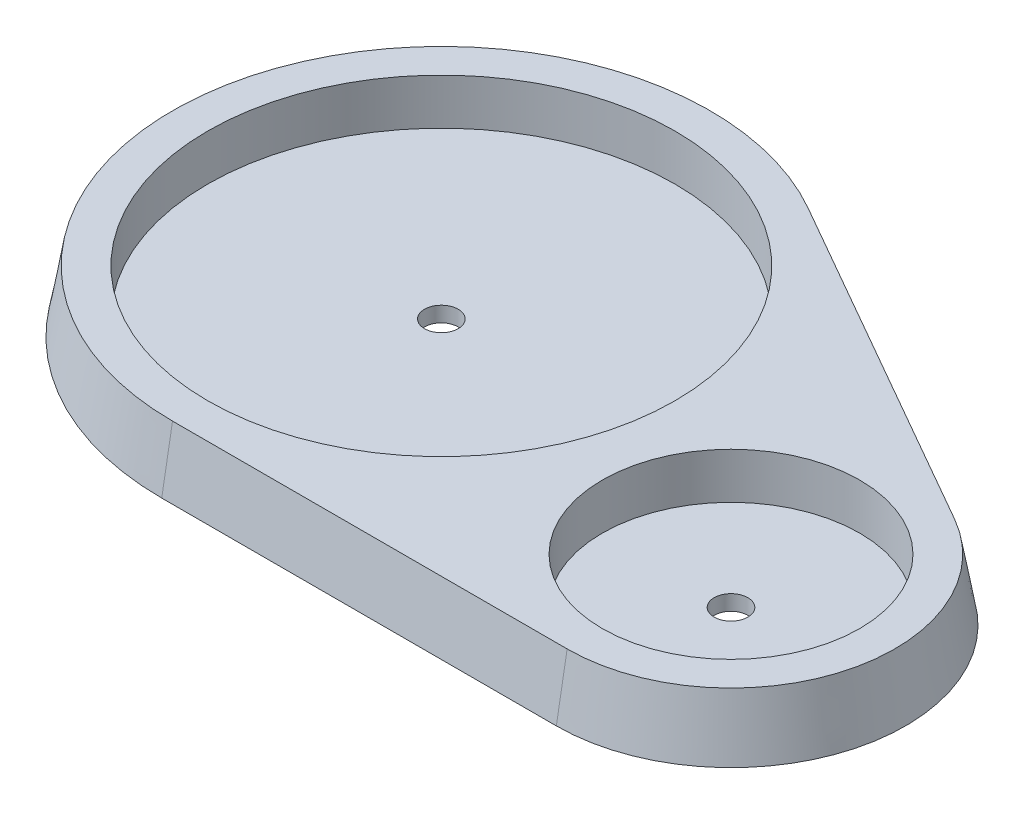
ISO-10303-21;
HEADER;
FILE_DESCRIPTION(('STEP AP214'),'2;1');
FILE_NAME('part.step','',(''),(''),'','','');
FILE_SCHEMA(('AUTOMOTIVE_DESIGN { 1 0 10303 214 1 1 1 1 }'));
ENDSEC;
DATA;
#1=APPLICATION_CONTEXT('core data for automotive mechanical design processes');
#2=APPLICATION_PROTOCOL_DEFINITION('international standard','automotive_design',2000,#1);
#3=PRODUCT_CONTEXT('',#1,'mechanical');
#4=PRODUCT('Part','Part','',(#3));
#5=PRODUCT_RELATED_PRODUCT_CATEGORY('part','',(#4));
#6=PRODUCT_DEFINITION_FORMATION('','',#4);
#7=PRODUCT_DEFINITION_CONTEXT('part definition',#1,'design');
#8=PRODUCT_DEFINITION('design','',#6,#7);
#9=PRODUCT_DEFINITION_SHAPE('','',#8);
#10=(LENGTH_UNIT() NAMED_UNIT(*) SI_UNIT(.MILLI.,.METRE.));
#11=(NAMED_UNIT(*) PLANE_ANGLE_UNIT() SI_UNIT($,.RADIAN.));
#12=(NAMED_UNIT(*) SI_UNIT($,.STERADIAN.) SOLID_ANGLE_UNIT());
#13=UNCERTAINTY_MEASURE_WITH_UNIT(LENGTH_MEASURE(1.E-05),#10,'distance_accuracy_value','');
#14=(GEOMETRIC_REPRESENTATION_CONTEXT(3) GLOBAL_UNCERTAINTY_ASSIGNED_CONTEXT((#13)) GLOBAL_UNIT_ASSIGNED_CONTEXT((#10,
#11,#12)) REPRESENTATION_CONTEXT('',''));
#15=CARTESIAN_POINT('',(0.,0.,0.));
#16=DIRECTION('',(0.,0.,1.));
#17=DIRECTION('',(1.,0.,0.));
#18=AXIS2_PLACEMENT_3D('',#15,#16,#17);
#19=CARTESIAN_POINT('',(25.7546112376017,0.,6.85));
#20=DIRECTION('',(0.,1.,0.));
#21=DIRECTION('',(0.,0.,1.));
#22=AXIS2_PLACEMENT_3D('',#19,#20,#21);
#23=CYLINDRICAL_SURFACE('',#22,1.1);
#24=CARTESIAN_POINT('',(25.7546112376017,0.,6.85));
#25=DIRECTION('',(0.,1.,0.));
#26=DIRECTION('',(0.,0.,1.));
#27=AXIS2_PLACEMENT_3D('',#24,#25,#26);
#28=CIRCLE('',#27,1.1);
#29=CARTESIAN_POINT('',(25.7546112376017,0.,7.95));
#30=VERTEX_POINT('',#29);
#31=EDGE_CURVE('E112',#30,#30,#28,.T.);
#32=ORIENTED_EDGE('',*,*,#31,.F.);
#33=EDGE_LOOP('',(#32));
#34=FACE_BOUND('',#33,.T.);
#35=CARTESIAN_POINT('',(25.7546112376017,1.,6.85));
#36=DIRECTION('',(0.,1.,0.));
#37=DIRECTION('',(0.,0.,1.));
#38=AXIS2_PLACEMENT_3D('',#35,#36,#37);
#39=CIRCLE('',#38,1.1);
#40=CARTESIAN_POINT('',(25.7546112376017,1.,7.95));
#41=VERTEX_POINT('',#40);
#42=EDGE_CURVE('E241',#41,#41,#39,.T.);
#43=ORIENTED_EDGE('',*,*,#42,.T.);
#44=EDGE_LOOP('',(#43));
#45=FACE_BOUND('',#44,.T.);
#46=ADVANCED_FACE('F50',(#34,#45),#23,.F.);
#47=CARTESIAN_POINT('',(0.,0.,0.));
#48=DIRECTION('',(0.,1.,0.));
#49=DIRECTION('',(0.,0.,1.));
#50=AXIS2_PLACEMENT_3D('',#47,#48,#49);
#51=CYLINDRICAL_SURFACE('',#50,1.1);
#52=CARTESIAN_POINT('',(0.,0.,0.));
#53=DIRECTION('',(0.,1.,0.));
#54=DIRECTION('',(0.,0.,1.));
#55=AXIS2_PLACEMENT_3D('',#52,#53,#54);
#56=CIRCLE('',#55,1.1);
#57=CARTESIAN_POINT('',(0.,0.,1.1));
#58=VERTEX_POINT('',#57);
#59=EDGE_CURVE('E109',#58,#58,#56,.T.);
#60=ORIENTED_EDGE('',*,*,#59,.F.);
#61=EDGE_LOOP('',(#60));
#62=FACE_BOUND('',#61,.T.);
#63=CARTESIAN_POINT('',(0.,1.,0.));
#64=DIRECTION('',(0.,1.,0.));
#65=DIRECTION('',(0.,0.,1.));
#66=AXIS2_PLACEMENT_3D('',#63,#64,#65);
#67=CIRCLE('',#66,1.1);
#68=CARTESIAN_POINT('',(0.,1.,1.1));
#69=VERTEX_POINT('',#68);
#70=EDGE_CURVE('E245',#69,#69,#67,.T.);
#71=ORIENTED_EDGE('',*,*,#70,.T.);
#72=EDGE_LOOP('',(#71));
#73=FACE_BOUND('',#72,.T.);
#74=ADVANCED_FACE('F141',(#62,#73),#51,.F.);
#75=CARTESIAN_POINT('',(0.,0.,18.25));
#76=DIRECTION('',(0.,0.173648177666931,0.984807753012208));
#77=DIRECTION('',(0.,-0.984807753012208,0.173648177666931));
#78=AXIS2_PLACEMENT_3D('',#75,#76,#77);
#79=PLANE('',#78);
#80=DIRECTION('',(1.,0.,0.));
#81=VECTOR('',#80,1.);
#82=CARTESIAN_POINT('',(0.,0.,18.25));
#83=LINE('',#82,#81);
#84=CARTESIAN_POINT('',(0.,0.,18.25));
#85=VERTEX_POINT('',#84);
#86=CARTESIAN_POINT('',(25.7546112376017,0.,18.25));
#87=VERTEX_POINT('',#86);
#88=EDGE_CURVE('E96',#85,#87,#83,.T.);
#89=ORIENTED_EDGE('',*,*,#88,.T.);
#90=DIRECTION('',(0.,-0.984807753012208,0.173648177666931));
#91=VECTOR('',#90,1.);
#92=CARTESIAN_POINT('',(25.7546112376017,0.,18.25));
#93=LINE('',#92,#91);
#94=CARTESIAN_POINT('',(25.7546112376017,4.,17.5446920771661));
#95=VERTEX_POINT('',#94);
#96=EDGE_CURVE('E12',#95,#87,#93,.T.);
#97=ORIENTED_EDGE('',*,*,#96,.F.);
#98=DIRECTION('',(-1.,0.,0.));
#99=VECTOR('',#98,1.);
#100=CARTESIAN_POINT('',(0.,4.,17.5446920771661));
#101=LINE('',#100,#99);
#102=CARTESIAN_POINT('',(0.,4.,17.5446920771661));
#103=VERTEX_POINT('',#102);
#104=EDGE_CURVE('E118',#103,#95,#101,.F.);
#105=ORIENTED_EDGE('',*,*,#104,.F.);
#106=DIRECTION('',(0.,-0.984807753012208,0.173648177666931));
#107=VECTOR('',#106,1.);
#108=CARTESIAN_POINT('',(0.,0.,18.25));
#109=LINE('',#108,#107);
#110=EDGE_CURVE('E108',#103,#85,#109,.T.);
#111=ORIENTED_EDGE('',*,*,#110,.T.);
#112=EDGE_LOOP('',(#89,#97,#105,#111));
#113=FACE_BOUND('',#112,.T.);
#114=ADVANCED_FACE('F107',(#113),#79,.T.);
#115=CARTESIAN_POINT('',(25.7546112376017,0.,6.85));
#116=DIRECTION('',(0.,-1.,0.));
#117=DIRECTION('',(0.,0.,1.));
#118=AXIS2_PLACEMENT_3D('',#115,#116,#117);
#119=CONICAL_SURFACE('',#118,11.4,0.174532925199433);
#120=CARTESIAN_POINT('',(25.7546112376017,0.,6.85));
#121=DIRECTION('',(0.,1.,0.));
#122=DIRECTION('',(0.,0.,1.));
#123=AXIS2_PLACEMENT_3D('',#120,#121,#122);
#124=CIRCLE('',#123,11.4);
#125=CARTESIAN_POINT('',(31.4181253942056,0.,-3.04366501342889));
#126=VERTEX_POINT('',#125);
#127=EDGE_CURVE('E92',#87,#126,#124,.T.);
#128=ORIENTED_EDGE('',*,*,#127,.T.);
#129=DIRECTION('',(0.0862683256565909,-0.984807753012208,-0.150703236844649));
#130=VECTOR('',#129,1.);
#131=CARTESIAN_POINT('',(31.4181253942056,0.,-3.04366501342889));
#132=LINE('',#131,#130);
#133=CARTESIAN_POINT('',(31.0677287796675,4.,-2.43155270467138));
#134=VERTEX_POINT('',#133);
#135=EDGE_CURVE('E59',#134,#126,#132,.T.);
#136=ORIENTED_EDGE('',*,*,#135,.F.);
#137=CARTESIAN_POINT('',(25.7546112376017,4.,6.85));
#138=DIRECTION('',(0.,1.,0.));
#139=DIRECTION('',(0.,0.,1.));
#140=AXIS2_PLACEMENT_3D('',#137,#138,#139);
#141=CIRCLE('',#140,10.6946920771661);
#142=EDGE_CURVE('E103',#95,#134,#141,.T.);
#143=ORIENTED_EDGE('',*,*,#142,.F.);
#144=ORIENTED_EDGE('',*,*,#96,.T.);
#145=EDGE_LOOP('',(#128,#136,#143,#144));
#146=FACE_BOUND('',#145,.T.);
#147=ADVANCED_FACE('F52',(#146),#119,.T.);
#148=CARTESIAN_POINT('',(9.0665906454405,0.,-15.8385426750068));
#149=DIRECTION('',(0.489251986905083,0.173648177666931,-0.854680527274597));
#150=DIRECTION('',(-0.867865352055166,0.,-0.496799487421397));
#151=AXIS2_PLACEMENT_3D('',#148,#149,#150);
#152=PLANE('',#151);
#153=DIRECTION('',(-0.867865352055166,0.,-0.496799487421397));
#154=VECTOR('',#153,1.);
#155=CARTESIAN_POINT('',(9.0665906454405,0.,-15.8385426750068));
#156=LINE('',#155,#154);
#157=CARTESIAN_POINT('',(9.0665906454405,0.,-15.8385426750068));
#158=VERTEX_POINT('',#157);
#159=EDGE_CURVE('E97',#126,#158,#156,.T.);
#160=ORIENTED_EDGE('',*,*,#159,.T.);
#161=DIRECTION('',(0.0862683256565909,-0.984807753012208,-0.150703236844649));
#162=VECTOR('',#161,1.);
#163=CARTESIAN_POINT('',(9.0665906454405,0.,-15.8385426750068));
#164=LINE('',#163,#162);
#165=CARTESIAN_POINT('',(8.71619403090238,4.,-15.2264303662493));
#166=VERTEX_POINT('',#165);
#167=EDGE_CURVE('E121',#166,#158,#164,.T.);
#168=ORIENTED_EDGE('',*,*,#167,.F.);
#169=DIRECTION('',(0.867865352055166,0.,0.496799487421397));
#170=VECTOR('',#169,1.);
#171=CARTESIAN_POINT('',(8.71619403090239,4.,-15.2264303662493));
#172=LINE('',#171,#170);
#173=EDGE_CURVE('E71',#134,#166,#172,.F.);
#174=ORIENTED_EDGE('',*,*,#173,.F.);
#175=ORIENTED_EDGE('',*,*,#135,.T.);
#176=EDGE_LOOP('',(#160,#168,#174,#175));
#177=FACE_BOUND('',#176,.T.);
#178=ADVANCED_FACE('F128',(#177),#152,.T.);
#179=CARTESIAN_POINT('',(0.,0.,0.));
#180=DIRECTION('',(0.,-1.,0.));
#181=DIRECTION('',(0.,0.,1.));
#182=AXIS2_PLACEMENT_3D('',#179,#180,#181);
#183=CONICAL_SURFACE('',#182,18.25,0.174532925199433);
#184=CARTESIAN_POINT('',(0.,0.,0.));
#185=DIRECTION('',(0.,1.,0.));
#186=DIRECTION('',(0.,0.,1.));
#187=AXIS2_PLACEMENT_3D('',#184,#185,#186);
#188=CIRCLE('',#187,18.25);
#189=EDGE_CURVE('E117',#158,#85,#188,.T.);
#190=ORIENTED_EDGE('',*,*,#189,.T.);
#191=ORIENTED_EDGE('',*,*,#110,.F.);
#192=CARTESIAN_POINT('',(0.,4.,0.));
#193=DIRECTION('',(0.,1.,0.));
#194=DIRECTION('',(0.,0.,1.));
#195=AXIS2_PLACEMENT_3D('',#192,#193,#194);
#196=CIRCLE('',#195,17.5446920771661);
#197=EDGE_CURVE('E54',#166,#103,#196,.T.);
#198=ORIENTED_EDGE('',*,*,#197,.F.);
#199=ORIENTED_EDGE('',*,*,#167,.T.);
#200=EDGE_LOOP('',(#190,#191,#198,#199));
#201=FACE_BOUND('',#200,.T.);
#202=ADVANCED_FACE('F130',(#201),#183,.T.);
#203=CARTESIAN_POINT('',(0.,4.,0.));
#204=DIRECTION('',(0.,1.,0.));
#205=DIRECTION('',(0.,0.,1.));
#206=AXIS2_PLACEMENT_3D('',#203,#204,#205);
#207=PLANE('',#206);
#208=CARTESIAN_POINT('',(0.,4.,0.));
#209=DIRECTION('',(0.,1.,0.));
#210=DIRECTION('',(0.,0.,1.));
#211=AXIS2_PLACEMENT_3D('',#208,#209,#210);
#212=CIRCLE('',#211,15.25);
#213=CARTESIAN_POINT('',(0.,4.,15.25));
#214=VERTEX_POINT('',#213);
#215=EDGE_CURVE('E249',#214,#214,#212,.T.);
#216=ORIENTED_EDGE('',*,*,#215,.F.);
#217=EDGE_LOOP('',(#216));
#218=FACE_BOUND('',#217,.T.);
#219=CARTESIAN_POINT('',(25.7546112376017,4.,6.85));
#220=DIRECTION('',(0.,1.,0.));
#221=DIRECTION('',(0.,0.,1.));
#222=AXIS2_PLACEMENT_3D('',#219,#220,#221);
#223=CIRCLE('',#222,8.4);
#224=CARTESIAN_POINT('',(25.7546112376017,4.,15.25));
#225=VERTEX_POINT('',#224);
#226=EDGE_CURVE('E246',#225,#225,#223,.T.);
#227=ORIENTED_EDGE('',*,*,#226,.F.);
#228=EDGE_LOOP('',(#227));
#229=FACE_BOUND('',#228,.T.);
#230=ORIENTED_EDGE('',*,*,#104,.T.);
#231=ORIENTED_EDGE('',*,*,#142,.T.);
#232=ORIENTED_EDGE('',*,*,#173,.T.);
#233=ORIENTED_EDGE('',*,*,#197,.T.);
#234=EDGE_LOOP('',(#230,#231,#232,#233));
#235=FACE_BOUND('',#234,.T.);
#236=ADVANCED_FACE('F126',(#218,#229,#235),#207,.T.);
#237=CARTESIAN_POINT('',(0.,0.,0.));
#238=DIRECTION('',(0.,1.,0.));
#239=DIRECTION('',(0.,0.,1.));
#240=AXIS2_PLACEMENT_3D('',#237,#238,#239);
#241=PLANE('',#240);
#242=ORIENTED_EDGE('',*,*,#59,.T.);
#243=EDGE_LOOP('',(#242));
#244=FACE_BOUND('',#243,.T.);
#245=ORIENTED_EDGE('',*,*,#31,.T.);
#246=EDGE_LOOP('',(#245));
#247=FACE_BOUND('',#246,.T.);
#248=ORIENTED_EDGE('',*,*,#88,.F.);
#249=ORIENTED_EDGE('',*,*,#189,.F.);
#250=ORIENTED_EDGE('',*,*,#159,.F.);
#251=ORIENTED_EDGE('',*,*,#127,.F.);
#252=EDGE_LOOP('',(#248,#249,#250,#251));
#253=FACE_BOUND('',#252,.T.);
#254=ADVANCED_FACE('F93',(#244,#247,#253),#241,.F.);
#255=CARTESIAN_POINT('',(0.,1.,0.));
#256=DIRECTION('',(0.,1.,0.));
#257=DIRECTION('',(0.,0.,1.));
#258=AXIS2_PLACEMENT_3D('',#255,#256,#257);
#259=CYLINDRICAL_SURFACE('',#258,15.25);
#260=CARTESIAN_POINT('',(0.,1.,0.));
#261=DIRECTION('',(0.,1.,0.));
#262=DIRECTION('',(0.,0.,1.));
#263=AXIS2_PLACEMENT_3D('',#260,#261,#262);
#264=CIRCLE('',#263,15.25);
#265=CARTESIAN_POINT('',(0.,1.,15.25));
#266=VERTEX_POINT('',#265);
#267=EDGE_CURVE('E257',#266,#266,#264,.T.);
#268=ORIENTED_EDGE('',*,*,#267,.F.);
#269=EDGE_LOOP('',(#268));
#270=FACE_BOUND('',#269,.T.);
#271=ORIENTED_EDGE('',*,*,#215,.T.);
#272=EDGE_LOOP('',(#271));
#273=FACE_BOUND('',#272,.T.);
#274=ADVANCED_FACE('F154',(#270,#273),#259,.F.);
#275=CARTESIAN_POINT('',(0.,1.,0.));
#276=DIRECTION('',(0.,1.,0.));
#277=DIRECTION('',(0.,0.,1.));
#278=AXIS2_PLACEMENT_3D('',#275,#276,#277);
#279=PLANE('',#278);
#280=ORIENTED_EDGE('',*,*,#70,.F.);
#281=EDGE_LOOP('',(#280));
#282=FACE_BOUND('',#281,.T.);
#283=ORIENTED_EDGE('',*,*,#267,.T.);
#284=EDGE_LOOP('',(#283));
#285=FACE_BOUND('',#284,.T.);
#286=ADVANCED_FACE('F205',(#282,#285),#279,.T.);
#287=CARTESIAN_POINT('',(25.7546112376017,1.,6.85));
#288=DIRECTION('',(0.,1.,0.));
#289=DIRECTION('',(0.,0.,1.));
#290=AXIS2_PLACEMENT_3D('',#287,#288,#289);
#291=CYLINDRICAL_SURFACE('',#290,8.4);
#292=CARTESIAN_POINT('',(25.7546112376017,1.,6.85));
#293=DIRECTION('',(0.,1.,0.));
#294=DIRECTION('',(0.,0.,1.));
#295=AXIS2_PLACEMENT_3D('',#292,#293,#294);
#296=CIRCLE('',#295,8.4);
#297=CARTESIAN_POINT('',(25.7546112376017,1.,15.25));
#298=VERTEX_POINT('',#297);
#299=EDGE_CURVE('E244',#298,#298,#296,.T.);
#300=ORIENTED_EDGE('',*,*,#299,.F.);
#301=EDGE_LOOP('',(#300));
#302=FACE_BOUND('',#301,.T.);
#303=ORIENTED_EDGE('',*,*,#226,.T.);
#304=EDGE_LOOP('',(#303));
#305=FACE_BOUND('',#304,.T.);
#306=ADVANCED_FACE('F215',(#302,#305),#291,.F.);
#307=CARTESIAN_POINT('',(25.7546112376017,1.,6.85));
#308=DIRECTION('',(0.,1.,0.));
#309=DIRECTION('',(0.,0.,1.));
#310=AXIS2_PLACEMENT_3D('',#307,#308,#309);
#311=PLANE('',#310);
#312=ORIENTED_EDGE('',*,*,#42,.F.);
#313=EDGE_LOOP('',(#312));
#314=FACE_BOUND('',#313,.T.);
#315=ORIENTED_EDGE('',*,*,#299,.T.);
#316=EDGE_LOOP('',(#315));
#317=FACE_BOUND('',#316,.T.);
#318=ADVANCED_FACE('F225',(#314,#317),#311,.T.);
#319=CLOSED_SHELL('',(#46,#74,#114,#147,#178,#202,#236,#254,#274,#286,#306,#318));
#320=MANIFOLD_SOLID_BREP('B2',#319);
#321=ADVANCED_BREP_SHAPE_REPRESENTATION('',(#18,#320),#14);
#322=SHAPE_DEFINITION_REPRESENTATION(#9,#321);
ENDSEC;
END-ISO-10303-21;
